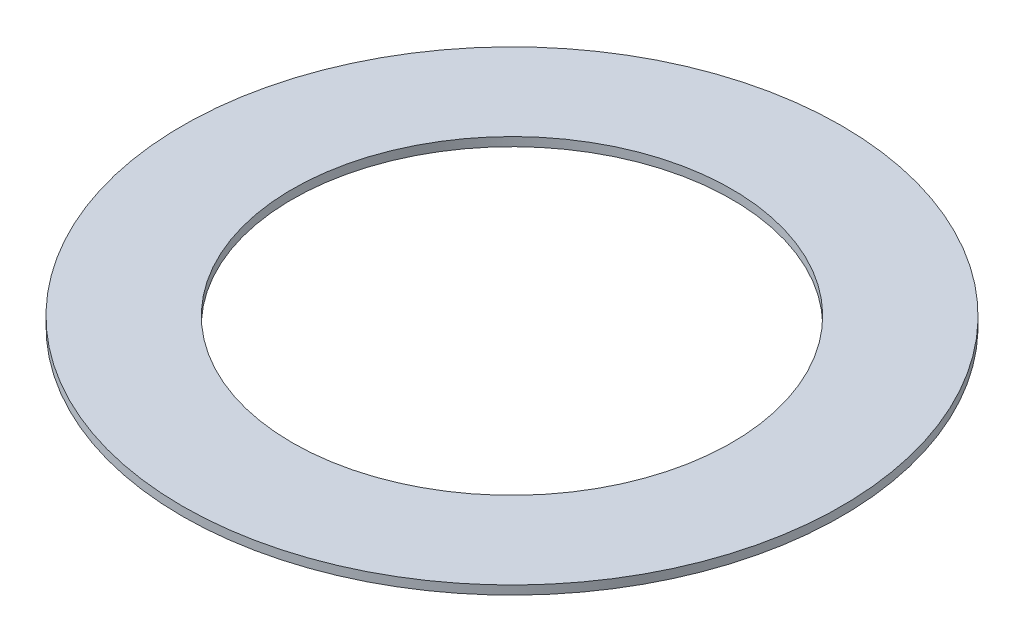
ISO-10303-21;
HEADER;
FILE_DESCRIPTION(('STEP AP214'),'2;1');
FILE_NAME('part.step','',(''),(''),'','','');
FILE_SCHEMA(('AUTOMOTIVE_DESIGN { 1 0 10303 214 1 1 1 1 }'));
ENDSEC;
DATA;
#1=APPLICATION_CONTEXT('core data for automotive mechanical design processes');
#2=APPLICATION_PROTOCOL_DEFINITION('international standard','automotive_design',2000,#1);
#3=PRODUCT_CONTEXT('',#1,'mechanical');
#4=PRODUCT('Part','Part','',(#3));
#5=PRODUCT_RELATED_PRODUCT_CATEGORY('part','',(#4));
#6=PRODUCT_DEFINITION_FORMATION('','',#4);
#7=PRODUCT_DEFINITION_CONTEXT('part definition',#1,'design');
#8=PRODUCT_DEFINITION('design','',#6,#7);
#9=PRODUCT_DEFINITION_SHAPE('','',#8);
#10=(LENGTH_UNIT() NAMED_UNIT(*) SI_UNIT(.MILLI.,.METRE.));
#11=(NAMED_UNIT(*) PLANE_ANGLE_UNIT() SI_UNIT($,.RADIAN.));
#12=(NAMED_UNIT(*) SI_UNIT($,.STERADIAN.) SOLID_ANGLE_UNIT());
#13=UNCERTAINTY_MEASURE_WITH_UNIT(LENGTH_MEASURE(1.E-05),#10,'distance_accuracy_value','');
#14=(GEOMETRIC_REPRESENTATION_CONTEXT(3) GLOBAL_UNCERTAINTY_ASSIGNED_CONTEXT((#13)) GLOBAL_UNIT_ASSIGNED_CONTEXT((#10,
#11,#12)) REPRESENTATION_CONTEXT('',''));
#15=CARTESIAN_POINT('',(0.,0.,0.));
#16=DIRECTION('',(0.,0.,1.));
#17=DIRECTION('',(1.,0.,0.));
#18=AXIS2_PLACEMENT_3D('',#15,#16,#17);
#19=CARTESIAN_POINT('',(0.,0.127,0.));
#20=DIRECTION('',(0.,1.,0.));
#21=DIRECTION('',(0.,0.,1.));
#22=AXIS2_PLACEMENT_3D('',#19,#20,#21);
#23=PLANE('',#22);
#24=CARTESIAN_POINT('',(0.,0.127,0.));
#25=DIRECTION('',(0.,1.,0.));
#26=DIRECTION('',(0.,0.,1.));
#27=AXIS2_PLACEMENT_3D('',#24,#25,#26);
#28=CIRCLE('',#27,4.7625);
#29=CARTESIAN_POINT('',(0.,0.127,4.7625));
#30=VERTEX_POINT('',#29);
#31=EDGE_CURVE('E10',#30,#30,#28,.T.);
#32=ORIENTED_EDGE('',*,*,#31,.T.);
#33=EDGE_LOOP('',(#32));
#34=FACE_BOUND('',#33,.T.);
#35=CARTESIAN_POINT('',(0.,0.127,0.));
#36=DIRECTION('',(0.,1.,0.));
#37=DIRECTION('',(0.,0.,1.));
#38=AXIS2_PLACEMENT_3D('',#35,#36,#37);
#39=CIRCLE('',#38,3.175);
#40=CARTESIAN_POINT('',(0.,0.127,3.175));
#41=VERTEX_POINT('',#40);
#42=EDGE_CURVE('E42',#41,#41,#39,.T.);
#43=ORIENTED_EDGE('',*,*,#42,.F.);
#44=EDGE_LOOP('',(#43));
#45=FACE_BOUND('',#44,.T.);
#46=ADVANCED_FACE('F31',(#34,#45),#23,.T.);
#47=CARTESIAN_POINT('',(0.,0.,0.));
#48=DIRECTION('',(0.,1.,0.));
#49=DIRECTION('',(0.,0.,1.));
#50=AXIS2_PLACEMENT_3D('',#47,#48,#49);
#51=PLANE('',#50);
#52=CARTESIAN_POINT('',(0.,0.,0.));
#53=DIRECTION('',(0.,1.,0.));
#54=DIRECTION('',(0.,0.,1.));
#55=AXIS2_PLACEMENT_3D('',#52,#53,#54);
#56=CIRCLE('',#55,4.7625);
#57=CARTESIAN_POINT('',(0.,0.,4.7625));
#58=VERTEX_POINT('',#57);
#59=EDGE_CURVE('E35',#58,#58,#56,.T.);
#60=ORIENTED_EDGE('',*,*,#59,.F.);
#61=EDGE_LOOP('',(#60));
#62=FACE_BOUND('',#61,.T.);
#63=CARTESIAN_POINT('',(0.,0.,0.));
#64=DIRECTION('',(0.,1.,0.));
#65=DIRECTION('',(0.,0.,1.));
#66=AXIS2_PLACEMENT_3D('',#63,#64,#65);
#67=CIRCLE('',#66,3.175);
#68=CARTESIAN_POINT('',(0.,0.,3.175));
#69=VERTEX_POINT('',#68);
#70=EDGE_CURVE('E44',#69,#69,#67,.T.);
#71=ORIENTED_EDGE('',*,*,#70,.T.);
#72=EDGE_LOOP('',(#71));
#73=FACE_BOUND('',#72,.T.);
#74=ADVANCED_FACE('F54',(#62,#73),#51,.F.);
#75=CARTESIAN_POINT('',(0.,0.127,0.));
#76=DIRECTION('',(0.,-1.,0.));
#77=DIRECTION('',(0.,0.,-1.));
#78=AXIS2_PLACEMENT_3D('',#75,#76,#77);
#79=CYLINDRICAL_SURFACE('',#78,4.7625);
#80=ORIENTED_EDGE('',*,*,#31,.F.);
#81=EDGE_LOOP('',(#80));
#82=FACE_BOUND('',#81,.T.);
#83=ORIENTED_EDGE('',*,*,#59,.T.);
#84=EDGE_LOOP('',(#83));
#85=FACE_BOUND('',#84,.T.);
#86=ADVANCED_FACE('F33',(#82,#85),#79,.T.);
#87=CARTESIAN_POINT('',(0.,0.127,0.));
#88=DIRECTION('',(0.,-1.,0.));
#89=DIRECTION('',(0.,0.,-1.));
#90=AXIS2_PLACEMENT_3D('',#87,#88,#89);
#91=CYLINDRICAL_SURFACE('',#90,3.175);
#92=ORIENTED_EDGE('',*,*,#42,.T.);
#93=EDGE_LOOP('',(#92));
#94=FACE_BOUND('',#93,.T.);
#95=ORIENTED_EDGE('',*,*,#70,.F.);
#96=EDGE_LOOP('',(#95));
#97=FACE_BOUND('',#96,.T.);
#98=ADVANCED_FACE('F50',(#94,#97),#91,.F.);
#99=CLOSED_SHELL('',(#46,#74,#86,#98));
#100=MANIFOLD_SOLID_BREP('B2',#99);
#101=ADVANCED_BREP_SHAPE_REPRESENTATION('',(#18,#100),#14);
#102=SHAPE_DEFINITION_REPRESENTATION(#9,#101);
ENDSEC;
END-ISO-10303-21;
